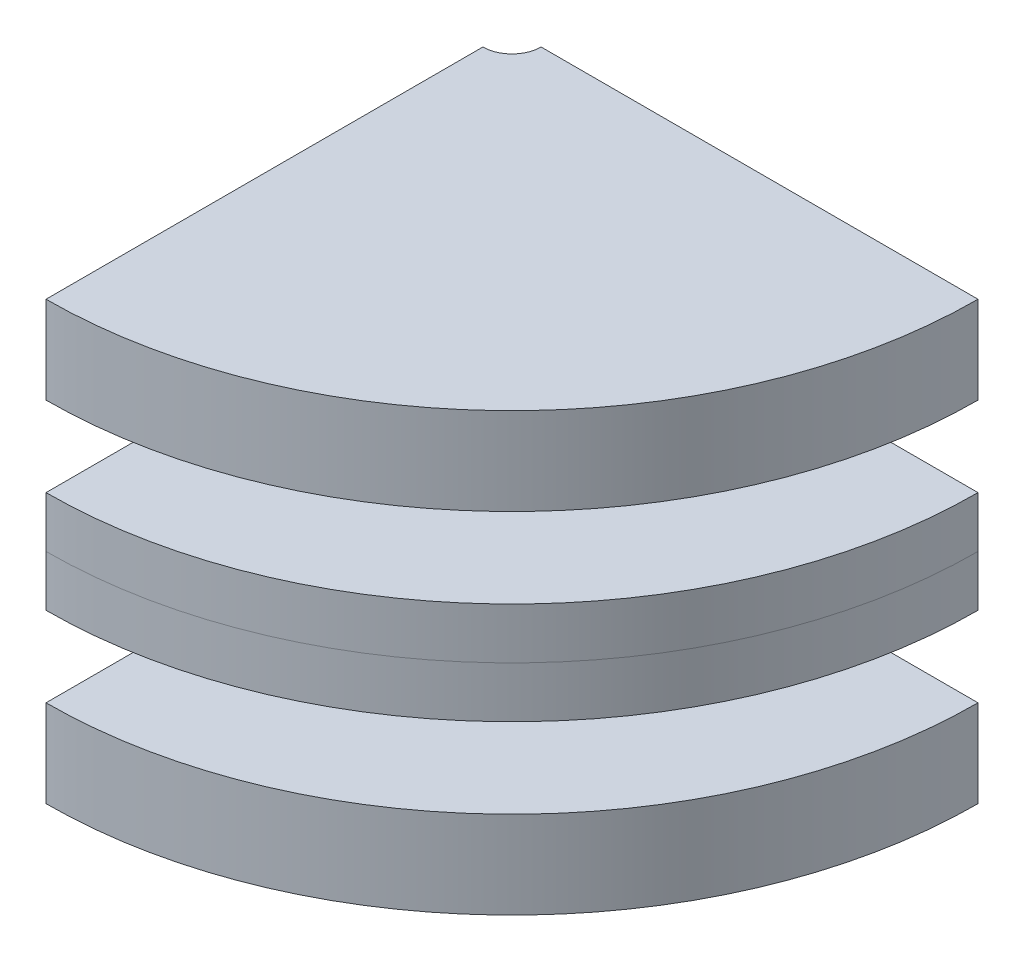
ISO-10303-21;
HEADER;
FILE_DESCRIPTION(('STEP AP214'),'2;1');
FILE_NAME('part.step','',(''),(''),'','','');
FILE_SCHEMA(('AUTOMOTIVE_DESIGN { 1 0 10303 214 1 1 1 1 }'));
ENDSEC;
DATA;
#1=APPLICATION_CONTEXT('core data for automotive mechanical design processes');
#2=APPLICATION_PROTOCOL_DEFINITION('international standard','automotive_design',2000,#1);
#3=PRODUCT_CONTEXT('',#1,'mechanical');
#4=PRODUCT('Part','Part','',(#3));
#5=PRODUCT_RELATED_PRODUCT_CATEGORY('part','',(#4));
#6=PRODUCT_DEFINITION_FORMATION('','',#4);
#7=PRODUCT_DEFINITION_CONTEXT('part definition',#1,'design');
#8=PRODUCT_DEFINITION('design','',#6,#7);
#9=PRODUCT_DEFINITION_SHAPE('','',#8);
#10=(LENGTH_UNIT() NAMED_UNIT(*) SI_UNIT(.MILLI.,.METRE.));
#11=(NAMED_UNIT(*) PLANE_ANGLE_UNIT() SI_UNIT($,.RADIAN.));
#12=(NAMED_UNIT(*) SI_UNIT($,.STERADIAN.) SOLID_ANGLE_UNIT());
#13=UNCERTAINTY_MEASURE_WITH_UNIT(LENGTH_MEASURE(1.E-05),#10,'distance_accuracy_value','');
#14=(GEOMETRIC_REPRESENTATION_CONTEXT(3) GLOBAL_UNCERTAINTY_ASSIGNED_CONTEXT((#13)) GLOBAL_UNIT_ASSIGNED_CONTEXT((#10,
#11,#12)) REPRESENTATION_CONTEXT('',''));
#15=CARTESIAN_POINT('',(0.,0.,0.));
#16=DIRECTION('',(0.,0.,1.));
#17=DIRECTION('',(1.,0.,0.));
#18=AXIS2_PLACEMENT_3D('',#15,#16,#17);
#19=CARTESIAN_POINT('',(0.,7.5,-16.));
#20=DIRECTION('',(0.,1.,0.));
#21=DIRECTION('',(0.,0.,-1.));
#22=AXIS2_PLACEMENT_3D('',#19,#20,#21);
#23=CYLINDRICAL_SURFACE('',#22,16.);
#24=CARTESIAN_POINT('',(0.,9.25,-16.));
#25=DIRECTION('',(0.,1.,0.));
#26=DIRECTION('',(0.,0.,1.));
#27=AXIS2_PLACEMENT_3D('',#24,#25,#26);
#28=CIRCLE('',#27,16.);
#29=CARTESIAN_POINT('',(0.,9.25,0.));
#30=VERTEX_POINT('',#29);
#31=CARTESIAN_POINT('',(16.,9.25,-16.));
#32=VERTEX_POINT('',#31);
#33=EDGE_CURVE('E107',#30,#32,#28,.T.);
#34=ORIENTED_EDGE('',*,*,#33,.F.);
#35=DIRECTION('',(0.,1.,0.));
#36=VECTOR('',#35,1.);
#37=CARTESIAN_POINT('',(0.,7.5,0.));
#38=LINE('',#37,#36);
#39=CARTESIAN_POINT('',(0.,7.5,0.));
#40=VERTEX_POINT('',#39);
#41=EDGE_CURVE('E106',#40,#30,#38,.T.);
#42=ORIENTED_EDGE('',*,*,#41,.F.);
#43=CARTESIAN_POINT('',(0.,7.5,-16.));
#44=DIRECTION('',(0.,1.,0.));
#45=DIRECTION('',(0.,0.,1.));
#46=AXIS2_PLACEMENT_3D('',#43,#44,#45);
#47=CIRCLE('',#46,16.);
#48=CARTESIAN_POINT('',(16.,7.5,-16.));
#49=VERTEX_POINT('',#48);
#50=EDGE_CURVE('E101',#40,#49,#47,.T.);
#51=ORIENTED_EDGE('',*,*,#50,.T.);
#52=DIRECTION('',(0.,1.,0.));
#53=VECTOR('',#52,1.);
#54=CARTESIAN_POINT('',(16.,7.5,-16.));
#55=LINE('',#54,#53);
#56=EDGE_CURVE('E12',#49,#32,#55,.T.);
#57=ORIENTED_EDGE('',*,*,#56,.T.);
#58=EDGE_LOOP('',(#34,#42,#51,#57));
#59=FACE_BOUND('',#58,.T.);
#60=ADVANCED_FACE('F44',(#59),#23,.T.);
#61=CARTESIAN_POINT('',(1.,7.5,-16.));
#62=DIRECTION('',(0.,0.,1.));
#63=DIRECTION('',(1.,0.,0.));
#64=AXIS2_PLACEMENT_3D('',#61,#62,#63);
#65=PLANE('',#64);
#66=DIRECTION('',(-1.,0.,0.));
#67=VECTOR('',#66,1.);
#68=CARTESIAN_POINT('',(1.,9.25,-16.));
#69=LINE('',#68,#67);
#70=CARTESIAN_POINT('',(1.,9.25,-16.));
#71=VERTEX_POINT('',#70);
#72=EDGE_CURVE('E109',#32,#71,#69,.T.);
#73=ORIENTED_EDGE('',*,*,#72,.F.);
#74=ORIENTED_EDGE('',*,*,#56,.F.);
#75=DIRECTION('',(-1.,0.,0.));
#76=VECTOR('',#75,1.);
#77=CARTESIAN_POINT('',(1.,7.5,-16.));
#78=LINE('',#77,#76);
#79=CARTESIAN_POINT('',(1.,7.5,-16.));
#80=VERTEX_POINT('',#79);
#81=EDGE_CURVE('E85',#49,#80,#78,.T.);
#82=ORIENTED_EDGE('',*,*,#81,.T.);
#83=DIRECTION('',(0.,1.,0.));
#84=VECTOR('',#83,1.);
#85=CARTESIAN_POINT('',(1.,7.5,-16.));
#86=LINE('',#85,#84);
#87=EDGE_CURVE('E52',#80,#71,#86,.T.);
#88=ORIENTED_EDGE('',*,*,#87,.T.);
#89=EDGE_LOOP('',(#73,#74,#82,#88));
#90=FACE_BOUND('',#89,.T.);
#91=ADVANCED_FACE('F99',(#90),#65,.F.);
#92=CARTESIAN_POINT('',(0.,7.5,-16.));
#93=DIRECTION('',(0.,1.,0.));
#94=DIRECTION('',(0.,0.,-1.));
#95=AXIS2_PLACEMENT_3D('',#92,#93,#94);
#96=CYLINDRICAL_SURFACE('',#95,1.);
#97=CARTESIAN_POINT('',(0.,9.25,-16.));
#98=DIRECTION('',(0.,-1.,0.));
#99=DIRECTION('',(0.,0.,1.));
#100=AXIS2_PLACEMENT_3D('',#97,#98,#99);
#101=CIRCLE('',#100,1.);
#102=CARTESIAN_POINT('',(0.,9.25,-15.));
#103=VERTEX_POINT('',#102);
#104=EDGE_CURVE('E95',#71,#103,#101,.T.);
#105=ORIENTED_EDGE('',*,*,#104,.F.);
#106=ORIENTED_EDGE('',*,*,#87,.F.);
#107=CARTESIAN_POINT('',(0.,7.5,-16.));
#108=DIRECTION('',(0.,-1.,0.));
#109=DIRECTION('',(0.,0.,1.));
#110=AXIS2_PLACEMENT_3D('',#107,#108,#109);
#111=CIRCLE('',#110,1.);
#112=CARTESIAN_POINT('',(0.,7.5,-15.));
#113=VERTEX_POINT('',#112);
#114=EDGE_CURVE('E88',#80,#113,#111,.T.);
#115=ORIENTED_EDGE('',*,*,#114,.T.);
#116=DIRECTION('',(0.,1.,0.));
#117=VECTOR('',#116,1.);
#118=CARTESIAN_POINT('',(0.,7.5,-15.));
#119=LINE('',#118,#117);
#120=EDGE_CURVE('E98',#113,#103,#119,.T.);
#121=ORIENTED_EDGE('',*,*,#120,.T.);
#122=EDGE_LOOP('',(#105,#106,#115,#121));
#123=FACE_BOUND('',#122,.T.);
#124=ADVANCED_FACE('F94',(#123),#96,.F.);
#125=CARTESIAN_POINT('',(0.,7.5,-15.));
#126=DIRECTION('',(1.,0.,0.));
#127=DIRECTION('',(0.,0.,-1.));
#128=AXIS2_PLACEMENT_3D('',#125,#126,#127);
#129=PLANE('',#128);
#130=DIRECTION('',(0.,0.,1.));
#131=VECTOR('',#130,1.);
#132=CARTESIAN_POINT('',(0.,9.25,-15.));
#133=LINE('',#132,#131);
#134=EDGE_CURVE('E74',#103,#30,#133,.T.);
#135=ORIENTED_EDGE('',*,*,#134,.F.);
#136=ORIENTED_EDGE('',*,*,#120,.F.);
#137=DIRECTION('',(0.,0.,1.));
#138=VECTOR('',#137,1.);
#139=CARTESIAN_POINT('',(0.,7.5,-15.));
#140=LINE('',#139,#138);
#141=EDGE_CURVE('E60',#113,#40,#140,.T.);
#142=ORIENTED_EDGE('',*,*,#141,.T.);
#143=ORIENTED_EDGE('',*,*,#41,.T.);
#144=EDGE_LOOP('',(#135,#136,#142,#143));
#145=FACE_BOUND('',#144,.T.);
#146=ADVANCED_FACE('F118',(#145),#129,.F.);
#147=CARTESIAN_POINT('',(0.,7.5,-16.));
#148=DIRECTION('',(0.,-1.,0.));
#149=DIRECTION('',(0.,0.,1.));
#150=AXIS2_PLACEMENT_3D('',#147,#148,#149);
#151=PLANE('',#150);
#152=ORIENTED_EDGE('',*,*,#50,.F.);
#153=ORIENTED_EDGE('',*,*,#141,.F.);
#154=ORIENTED_EDGE('',*,*,#114,.F.);
#155=ORIENTED_EDGE('',*,*,#81,.F.);
#156=EDGE_LOOP('',(#152,#153,#154,#155));
#157=FACE_BOUND('',#156,.T.);
#158=ADVANCED_FACE('F90',(#157),#151,.T.);
#159=CARTESIAN_POINT('',(0.,9.25,-16.));
#160=DIRECTION('',(0.,-1.,0.));
#161=DIRECTION('',(0.,0.,1.));
#162=AXIS2_PLACEMENT_3D('',#159,#160,#161);
#163=PLANE('',#162);
#164=ORIENTED_EDGE('',*,*,#33,.T.);
#165=ORIENTED_EDGE('',*,*,#72,.T.);
#166=ORIENTED_EDGE('',*,*,#104,.T.);
#167=ORIENTED_EDGE('',*,*,#134,.T.);
#168=EDGE_LOOP('',(#164,#165,#166,#167));
#169=FACE_BOUND('',#168,.T.);
#170=ADVANCED_FACE('F114',(#169),#163,.F.);
#171=CLOSED_SHELL('',(#60,#91,#124,#146,#158,#170));
#172=MANIFOLD_SOLID_BREP('B2',#171);
#173=CARTESIAN_POINT('',(0.,12.,-16.));
#174=DIRECTION('',(0.,1.,0.));
#175=DIRECTION('',(0.,0.,-1.));
#176=AXIS2_PLACEMENT_3D('',#173,#174,#175);
#177=CYLINDRICAL_SURFACE('',#176,16.);
#178=CARTESIAN_POINT('',(0.,15.,-16.));
#179=DIRECTION('',(0.,1.,0.));
#180=DIRECTION('',(0.,0.,1.));
#181=AXIS2_PLACEMENT_3D('',#178,#179,#180);
#182=CIRCLE('',#181,16.);
#183=CARTESIAN_POINT('',(0.,15.,0.));
#184=VERTEX_POINT('',#183);
#185=CARTESIAN_POINT('',(16.,15.,-16.));
#186=VERTEX_POINT('',#185);
#187=EDGE_CURVE('E241',#184,#186,#182,.T.);
#188=ORIENTED_EDGE('',*,*,#187,.F.);
#189=DIRECTION('',(0.,1.,0.));
#190=VECTOR('',#189,1.);
#191=CARTESIAN_POINT('',(0.,12.,0.));
#192=LINE('',#191,#190);
#193=CARTESIAN_POINT('',(0.,12.,0.));
#194=VERTEX_POINT('',#193);
#195=EDGE_CURVE('E240',#194,#184,#192,.T.);
#196=ORIENTED_EDGE('',*,*,#195,.F.);
#197=CARTESIAN_POINT('',(0.,12.,-16.));
#198=DIRECTION('',(0.,1.,0.));
#199=DIRECTION('',(0.,0.,1.));
#200=AXIS2_PLACEMENT_3D('',#197,#198,#199);
#201=CIRCLE('',#200,16.);
#202=CARTESIAN_POINT('',(16.,12.,-16.));
#203=VERTEX_POINT('',#202);
#204=EDGE_CURVE('E235',#194,#203,#201,.T.);
#205=ORIENTED_EDGE('',*,*,#204,.T.);
#206=DIRECTION('',(0.,1.,0.));
#207=VECTOR('',#206,1.);
#208=CARTESIAN_POINT('',(16.,12.,-16.));
#209=LINE('',#208,#207);
#210=EDGE_CURVE('E42',#203,#186,#209,.T.);
#211=ORIENTED_EDGE('',*,*,#210,.T.);
#212=EDGE_LOOP('',(#188,#196,#205,#211));
#213=FACE_BOUND('',#212,.T.);
#214=ADVANCED_FACE('F178',(#213),#177,.T.);
#215=CARTESIAN_POINT('',(1.,12.,-16.));
#216=DIRECTION('',(0.,0.,1.));
#217=DIRECTION('',(1.,0.,0.));
#218=AXIS2_PLACEMENT_3D('',#215,#216,#217);
#219=PLANE('',#218);
#220=DIRECTION('',(-1.,0.,0.));
#221=VECTOR('',#220,1.);
#222=CARTESIAN_POINT('',(1.,15.,-16.));
#223=LINE('',#222,#221);
#224=CARTESIAN_POINT('',(1.,15.,-16.));
#225=VERTEX_POINT('',#224);
#226=EDGE_CURVE('E243',#186,#225,#223,.T.);
#227=ORIENTED_EDGE('',*,*,#226,.F.);
#228=ORIENTED_EDGE('',*,*,#210,.F.);
#229=DIRECTION('',(-1.,0.,0.));
#230=VECTOR('',#229,1.);
#231=CARTESIAN_POINT('',(1.,12.,-16.));
#232=LINE('',#231,#230);
#233=CARTESIAN_POINT('',(1.,12.,-16.));
#234=VERTEX_POINT('',#233);
#235=EDGE_CURVE('E219',#203,#234,#232,.T.);
#236=ORIENTED_EDGE('',*,*,#235,.T.);
#237=DIRECTION('',(0.,1.,0.));
#238=VECTOR('',#237,1.);
#239=CARTESIAN_POINT('',(1.,12.,-16.));
#240=LINE('',#239,#238);
#241=EDGE_CURVE('E186',#234,#225,#240,.T.);
#242=ORIENTED_EDGE('',*,*,#241,.T.);
#243=EDGE_LOOP('',(#227,#228,#236,#242));
#244=FACE_BOUND('',#243,.T.);
#245=ADVANCED_FACE('F233',(#244),#219,.F.);
#246=CARTESIAN_POINT('',(0.,12.,-16.));
#247=DIRECTION('',(0.,1.,0.));
#248=DIRECTION('',(0.,0.,-1.));
#249=AXIS2_PLACEMENT_3D('',#246,#247,#248);
#250=CYLINDRICAL_SURFACE('',#249,1.);
#251=CARTESIAN_POINT('',(0.,15.,-16.));
#252=DIRECTION('',(0.,-1.,0.));
#253=DIRECTION('',(0.,0.,1.));
#254=AXIS2_PLACEMENT_3D('',#251,#252,#253);
#255=CIRCLE('',#254,1.);
#256=CARTESIAN_POINT('',(0.,15.,-15.));
#257=VERTEX_POINT('',#256);
#258=EDGE_CURVE('E229',#225,#257,#255,.T.);
#259=ORIENTED_EDGE('',*,*,#258,.F.);
#260=ORIENTED_EDGE('',*,*,#241,.F.);
#261=CARTESIAN_POINT('',(0.,12.,-16.));
#262=DIRECTION('',(0.,-1.,0.));
#263=DIRECTION('',(0.,0.,1.));
#264=AXIS2_PLACEMENT_3D('',#261,#262,#263);
#265=CIRCLE('',#264,1.);
#266=CARTESIAN_POINT('',(0.,12.,-15.));
#267=VERTEX_POINT('',#266);
#268=EDGE_CURVE('E222',#234,#267,#265,.T.);
#269=ORIENTED_EDGE('',*,*,#268,.T.);
#270=DIRECTION('',(0.,1.,0.));
#271=VECTOR('',#270,1.);
#272=CARTESIAN_POINT('',(0.,12.,-15.));
#273=LINE('',#272,#271);
#274=EDGE_CURVE('E232',#267,#257,#273,.T.);
#275=ORIENTED_EDGE('',*,*,#274,.T.);
#276=EDGE_LOOP('',(#259,#260,#269,#275));
#277=FACE_BOUND('',#276,.T.);
#278=ADVANCED_FACE('F228',(#277),#250,.F.);
#279=CARTESIAN_POINT('',(0.,12.,0.));
#280=DIRECTION('',(1.,0.,0.));
#281=DIRECTION('',(0.,0.,-1.));
#282=AXIS2_PLACEMENT_3D('',#279,#280,#281);
#283=PLANE('',#282);
#284=DIRECTION('',(0.,0.,1.));
#285=VECTOR('',#284,1.);
#286=CARTESIAN_POINT('',(0.,15.,0.));
#287=LINE('',#286,#285);
#288=EDGE_CURVE('E208',#257,#184,#287,.T.);
#289=ORIENTED_EDGE('',*,*,#288,.F.);
#290=ORIENTED_EDGE('',*,*,#274,.F.);
#291=DIRECTION('',(0.,0.,1.));
#292=VECTOR('',#291,1.);
#293=CARTESIAN_POINT('',(0.,12.,0.));
#294=LINE('',#293,#292);
#295=EDGE_CURVE('E194',#267,#194,#294,.T.);
#296=ORIENTED_EDGE('',*,*,#295,.T.);
#297=ORIENTED_EDGE('',*,*,#195,.T.);
#298=EDGE_LOOP('',(#289,#290,#296,#297));
#299=FACE_BOUND('',#298,.T.);
#300=ADVANCED_FACE('F252',(#299),#283,.F.);
#301=CARTESIAN_POINT('',(0.,12.,-16.));
#302=DIRECTION('',(0.,-1.,0.));
#303=DIRECTION('',(0.,0.,1.));
#304=AXIS2_PLACEMENT_3D('',#301,#302,#303);
#305=PLANE('',#304);
#306=ORIENTED_EDGE('',*,*,#204,.F.);
#307=ORIENTED_EDGE('',*,*,#295,.F.);
#308=ORIENTED_EDGE('',*,*,#268,.F.);
#309=ORIENTED_EDGE('',*,*,#235,.F.);
#310=EDGE_LOOP('',(#306,#307,#308,#309));
#311=FACE_BOUND('',#310,.T.);
#312=ADVANCED_FACE('F224',(#311),#305,.T.);
#313=CARTESIAN_POINT('',(0.,15.,-16.));
#314=DIRECTION('',(0.,-1.,0.));
#315=DIRECTION('',(0.,0.,1.));
#316=AXIS2_PLACEMENT_3D('',#313,#314,#315);
#317=PLANE('',#316);
#318=ORIENTED_EDGE('',*,*,#187,.T.);
#319=ORIENTED_EDGE('',*,*,#226,.T.);
#320=ORIENTED_EDGE('',*,*,#258,.T.);
#321=ORIENTED_EDGE('',*,*,#288,.T.);
#322=EDGE_LOOP('',(#318,#319,#320,#321));
#323=FACE_BOUND('',#322,.T.);
#324=ADVANCED_FACE('F248',(#323),#317,.F.);
#325=CLOSED_SHELL('',(#214,#245,#278,#300,#312,#324));
#326=MANIFOLD_SOLID_BREP('B6',#325);
#327=CARTESIAN_POINT('',(0.,7.5,-16.));
#328=DIRECTION('',(0.,-1.,0.));
#329=DIRECTION('',(0.,0.,-1.));
#330=AXIS2_PLACEMENT_3D('',#327,#328,#329);
#331=CYLINDRICAL_SURFACE('',#330,16.);
#332=CARTESIAN_POINT('',(0.,5.75,-16.));
#333=DIRECTION('',(0.,1.,0.));
#334=DIRECTION('',(0.,0.,1.));
#335=AXIS2_PLACEMENT_3D('',#332,#333,#334);
#336=CIRCLE('',#335,16.);
#337=CARTESIAN_POINT('',(0.,5.75,0.));
#338=VERTEX_POINT('',#337);
#339=CARTESIAN_POINT('',(16.,5.75,-16.));
#340=VERTEX_POINT('',#339);
#341=EDGE_CURVE('E374',#338,#340,#336,.T.);
#342=ORIENTED_EDGE('',*,*,#341,.T.);
#343=DIRECTION('',(0.,-1.,0.));
#344=VECTOR('',#343,1.);
#345=CARTESIAN_POINT('',(16.,7.5,-16.));
#346=LINE('',#345,#344);
#347=CARTESIAN_POINT('',(16.,7.5,-16.));
#348=VERTEX_POINT('',#347);
#349=EDGE_CURVE('E176',#348,#340,#346,.T.);
#350=ORIENTED_EDGE('',*,*,#349,.F.);
#351=CARTESIAN_POINT('',(0.,7.5,-16.));
#352=DIRECTION('',(0.,1.,0.));
#353=DIRECTION('',(0.,0.,1.));
#354=AXIS2_PLACEMENT_3D('',#351,#352,#353);
#355=CIRCLE('',#354,16.);
#356=CARTESIAN_POINT('',(0.,7.5,0.));
#357=VERTEX_POINT('',#356);
#358=EDGE_CURVE('E362',#357,#348,#355,.T.);
#359=ORIENTED_EDGE('',*,*,#358,.F.);
#360=DIRECTION('',(0.,-1.,0.));
#361=VECTOR('',#360,1.);
#362=CARTESIAN_POINT('',(0.,7.5,0.));
#363=LINE('',#362,#361);
#364=EDGE_CURVE('E370',#357,#338,#363,.T.);
#365=ORIENTED_EDGE('',*,*,#364,.T.);
#366=EDGE_LOOP('',(#342,#350,#359,#365));
#367=FACE_BOUND('',#366,.T.);
#368=ADVANCED_FACE('F311',(#367),#331,.T.);
#369=CARTESIAN_POINT('',(1.,7.5,-16.));
#370=DIRECTION('',(0.,0.,1.));
#371=DIRECTION('',(1.,0.,0.));
#372=AXIS2_PLACEMENT_3D('',#369,#370,#371);
#373=PLANE('',#372);
#374=DIRECTION('',(-1.,0.,0.));
#375=VECTOR('',#374,1.);
#376=CARTESIAN_POINT('',(1.,5.75,-16.));
#377=LINE('',#376,#375);
#378=CARTESIAN_POINT('',(1.,5.75,-16.));
#379=VERTEX_POINT('',#378);
#380=EDGE_CURVE('E366',#340,#379,#377,.T.);
#381=ORIENTED_EDGE('',*,*,#380,.T.);
#382=DIRECTION('',(0.,-1.,0.));
#383=VECTOR('',#382,1.);
#384=CARTESIAN_POINT('',(1.,7.5,-16.));
#385=LINE('',#384,#383);
#386=CARTESIAN_POINT('',(1.,7.5,-16.));
#387=VERTEX_POINT('',#386);
#388=EDGE_CURVE('E319',#387,#379,#385,.T.);
#389=ORIENTED_EDGE('',*,*,#388,.F.);
#390=DIRECTION('',(-1.,0.,0.));
#391=VECTOR('',#390,1.);
#392=CARTESIAN_POINT('',(1.,7.5,-16.));
#393=LINE('',#392,#391);
#394=EDGE_CURVE('E357',#348,#387,#393,.T.);
#395=ORIENTED_EDGE('',*,*,#394,.F.);
#396=ORIENTED_EDGE('',*,*,#349,.T.);
#397=EDGE_LOOP('',(#381,#389,#395,#396));
#398=FACE_BOUND('',#397,.T.);
#399=ADVANCED_FACE('F365',(#398),#373,.F.);
#400=CARTESIAN_POINT('',(0.,7.5,-16.));
#401=DIRECTION('',(0.,-1.,0.));
#402=DIRECTION('',(0.,0.,-1.));
#403=AXIS2_PLACEMENT_3D('',#400,#401,#402);
#404=CYLINDRICAL_SURFACE('',#403,1.);
#405=CARTESIAN_POINT('',(0.,5.75,-16.));
#406=DIRECTION('',(0.,-1.,0.));
#407=DIRECTION('',(0.,0.,1.));
#408=AXIS2_PLACEMENT_3D('',#405,#406,#407);
#409=CIRCLE('',#408,1.);
#410=CARTESIAN_POINT('',(0.,5.75,-15.));
#411=VERTEX_POINT('',#410);
#412=EDGE_CURVE('E344',#379,#411,#409,.T.);
#413=ORIENTED_EDGE('',*,*,#412,.T.);
#414=DIRECTION('',(0.,-1.,0.));
#415=VECTOR('',#414,1.);
#416=CARTESIAN_POINT('',(0.,7.5,-15.));
#417=LINE('',#416,#415);
#418=CARTESIAN_POINT('',(0.,7.5,-15.));
#419=VERTEX_POINT('',#418);
#420=EDGE_CURVE('E367',#419,#411,#417,.T.);
#421=ORIENTED_EDGE('',*,*,#420,.F.);
#422=CARTESIAN_POINT('',(0.,7.5,-16.));
#423=DIRECTION('',(0.,-1.,0.));
#424=DIRECTION('',(0.,0.,1.));
#425=AXIS2_PLACEMENT_3D('',#422,#423,#424);
#426=CIRCLE('',#425,1.);
#427=EDGE_CURVE('E360',#387,#419,#426,.T.);
#428=ORIENTED_EDGE('',*,*,#427,.F.);
#429=ORIENTED_EDGE('',*,*,#388,.T.);
#430=EDGE_LOOP('',(#413,#421,#428,#429));
#431=FACE_BOUND('',#430,.T.);
#432=ADVANCED_FACE('F368',(#431),#404,.F.);
#433=CARTESIAN_POINT('',(0.,7.5,-15.));
#434=DIRECTION('',(1.,0.,0.));
#435=DIRECTION('',(0.,0.,-1.));
#436=AXIS2_PLACEMENT_3D('',#433,#434,#435);
#437=PLANE('',#436);
#438=DIRECTION('',(0.,0.,1.));
#439=VECTOR('',#438,1.);
#440=CARTESIAN_POINT('',(0.,5.75,-15.));
#441=LINE('',#440,#439);
#442=EDGE_CURVE('E350',#411,#338,#441,.T.);
#443=ORIENTED_EDGE('',*,*,#442,.T.);
#444=ORIENTED_EDGE('',*,*,#364,.F.);
#445=DIRECTION('',(0.,0.,1.));
#446=VECTOR('',#445,1.);
#447=CARTESIAN_POINT('',(0.,7.5,-15.));
#448=LINE('',#447,#446);
#449=EDGE_CURVE('E327',#419,#357,#448,.T.);
#450=ORIENTED_EDGE('',*,*,#449,.F.);
#451=ORIENTED_EDGE('',*,*,#420,.T.);
#452=EDGE_LOOP('',(#443,#444,#450,#451));
#453=FACE_BOUND('',#452,.T.);
#454=ADVANCED_FACE('F381',(#453),#437,.F.);
#455=CARTESIAN_POINT('',(0.,7.5,-16.));
#456=DIRECTION('',(0.,1.,0.));
#457=DIRECTION('',(0.,0.,1.));
#458=AXIS2_PLACEMENT_3D('',#455,#456,#457);
#459=PLANE('',#458);
#460=ORIENTED_EDGE('',*,*,#358,.T.);
#461=ORIENTED_EDGE('',*,*,#394,.T.);
#462=ORIENTED_EDGE('',*,*,#427,.T.);
#463=ORIENTED_EDGE('',*,*,#449,.T.);
#464=EDGE_LOOP('',(#460,#461,#462,#463));
#465=FACE_BOUND('',#464,.T.);
#466=ADVANCED_FACE('F358',(#465),#459,.T.);
#467=CARTESIAN_POINT('',(0.,5.75,-16.));
#468=DIRECTION('',(0.,1.,0.));
#469=DIRECTION('',(0.,0.,1.));
#470=AXIS2_PLACEMENT_3D('',#467,#468,#469);
#471=PLANE('',#470);
#472=ORIENTED_EDGE('',*,*,#341,.F.);
#473=ORIENTED_EDGE('',*,*,#442,.F.);
#474=ORIENTED_EDGE('',*,*,#412,.F.);
#475=ORIENTED_EDGE('',*,*,#380,.F.);
#476=EDGE_LOOP('',(#472,#473,#474,#475));
#477=FACE_BOUND('',#476,.T.);
#478=ADVANCED_FACE('F384',(#477),#471,.F.);
#479=CLOSED_SHELL('',(#368,#399,#432,#454,#466,#478));
#480=MANIFOLD_SOLID_BREP('B36',#479);
#481=CARTESIAN_POINT('',(0.,3.,-16.));
#482=DIRECTION('',(0.,-1.,0.));
#483=DIRECTION('',(0.,0.,-1.));
#484=AXIS2_PLACEMENT_3D('',#481,#482,#483);
#485=CYLINDRICAL_SURFACE('',#484,16.);
#486=CARTESIAN_POINT('',(0.,0.,-16.));
#487=DIRECTION('',(0.,1.,0.));
#488=DIRECTION('',(0.,0.,1.));
#489=AXIS2_PLACEMENT_3D('',#486,#487,#488);
#490=CIRCLE('',#489,16.);
#491=CARTESIAN_POINT('',(0.,0.,0.));
#492=VERTEX_POINT('',#491);
#493=CARTESIAN_POINT('',(16.,0.,-16.));
#494=VERTEX_POINT('',#493);
#495=EDGE_CURVE('E498',#492,#494,#490,.T.);
#496=ORIENTED_EDGE('',*,*,#495,.T.);
#497=DIRECTION('',(0.,-1.,0.));
#498=VECTOR('',#497,1.);
#499=CARTESIAN_POINT('',(16.,3.,-16.));
#500=LINE('',#499,#498);
#501=CARTESIAN_POINT('',(16.,3.,-16.));
#502=VERTEX_POINT('',#501);
#503=EDGE_CURVE('E309',#502,#494,#500,.T.);
#504=ORIENTED_EDGE('',*,*,#503,.F.);
#505=CARTESIAN_POINT('',(0.,3.,-16.));
#506=DIRECTION('',(0.,1.,0.));
#507=DIRECTION('',(0.,0.,1.));
#508=AXIS2_PLACEMENT_3D('',#505,#506,#507);
#509=CIRCLE('',#508,16.);
#510=CARTESIAN_POINT('',(0.,3.,0.));
#511=VERTEX_POINT('',#510);
#512=EDGE_CURVE('E486',#511,#502,#509,.T.);
#513=ORIENTED_EDGE('',*,*,#512,.F.);
#514=DIRECTION('',(0.,-1.,0.));
#515=VECTOR('',#514,1.);
#516=CARTESIAN_POINT('',(0.,3.,0.));
#517=LINE('',#516,#515);
#518=EDGE_CURVE('E494',#511,#492,#517,.T.);
#519=ORIENTED_EDGE('',*,*,#518,.T.);
#520=EDGE_LOOP('',(#496,#504,#513,#519));
#521=FACE_BOUND('',#520,.T.);
#522=ADVANCED_FACE('F435',(#521),#485,.T.);
#523=CARTESIAN_POINT('',(1.,3.,-16.));
#524=DIRECTION('',(0.,0.,1.));
#525=DIRECTION('',(1.,0.,0.));
#526=AXIS2_PLACEMENT_3D('',#523,#524,#525);
#527=PLANE('',#526);
#528=DIRECTION('',(-1.,0.,0.));
#529=VECTOR('',#528,1.);
#530=CARTESIAN_POINT('',(1.,0.,-16.));
#531=LINE('',#530,#529);
#532=CARTESIAN_POINT('',(1.,0.,-16.));
#533=VERTEX_POINT('',#532);
#534=EDGE_CURVE('E490',#494,#533,#531,.T.);
#535=ORIENTED_EDGE('',*,*,#534,.T.);
#536=DIRECTION('',(0.,-1.,0.));
#537=VECTOR('',#536,1.);
#538=CARTESIAN_POINT('',(1.,3.,-16.));
#539=LINE('',#538,#537);
#540=CARTESIAN_POINT('',(1.,3.,-16.));
#541=VERTEX_POINT('',#540);
#542=EDGE_CURVE('E443',#541,#533,#539,.T.);
#543=ORIENTED_EDGE('',*,*,#542,.F.);
#544=DIRECTION('',(-1.,0.,0.));
#545=VECTOR('',#544,1.);
#546=CARTESIAN_POINT('',(1.,3.,-16.));
#547=LINE('',#546,#545);
#548=EDGE_CURVE('E481',#502,#541,#547,.T.);
#549=ORIENTED_EDGE('',*,*,#548,.F.);
#550=ORIENTED_EDGE('',*,*,#503,.T.);
#551=EDGE_LOOP('',(#535,#543,#549,#550));
#552=FACE_BOUND('',#551,.T.);
#553=ADVANCED_FACE('F489',(#552),#527,.F.);
#554=CARTESIAN_POINT('',(0.,3.,-16.));
#555=DIRECTION('',(0.,-1.,0.));
#556=DIRECTION('',(0.,0.,-1.));
#557=AXIS2_PLACEMENT_3D('',#554,#555,#556);
#558=CYLINDRICAL_SURFACE('',#557,1.);
#559=CARTESIAN_POINT('',(0.,0.,-16.));
#560=DIRECTION('',(0.,-1.,0.));
#561=DIRECTION('',(0.,0.,1.));
#562=AXIS2_PLACEMENT_3D('',#559,#560,#561);
#563=CIRCLE('',#562,1.);
#564=CARTESIAN_POINT('',(0.,0.,-15.));
#565=VERTEX_POINT('',#564);
#566=EDGE_CURVE('E468',#533,#565,#563,.T.);
#567=ORIENTED_EDGE('',*,*,#566,.T.);
#568=DIRECTION('',(0.,-1.,0.));
#569=VECTOR('',#568,1.);
#570=CARTESIAN_POINT('',(0.,3.,-15.));
#571=LINE('',#570,#569);
#572=CARTESIAN_POINT('',(0.,3.,-15.));
#573=VERTEX_POINT('',#572);
#574=EDGE_CURVE('E491',#573,#565,#571,.T.);
#575=ORIENTED_EDGE('',*,*,#574,.F.);
#576=CARTESIAN_POINT('',(0.,3.,-16.));
#577=DIRECTION('',(0.,-1.,0.));
#578=DIRECTION('',(0.,0.,1.));
#579=AXIS2_PLACEMENT_3D('',#576,#577,#578);
#580=CIRCLE('',#579,1.);
#581=EDGE_CURVE('E484',#541,#573,#580,.T.);
#582=ORIENTED_EDGE('',*,*,#581,.F.);
#583=ORIENTED_EDGE('',*,*,#542,.T.);
#584=EDGE_LOOP('',(#567,#575,#582,#583));
#585=FACE_BOUND('',#584,.T.);
#586=ADVANCED_FACE('F492',(#585),#558,.F.);
#587=CARTESIAN_POINT('',(0.,3.,0.));
#588=DIRECTION('',(1.,0.,0.));
#589=DIRECTION('',(0.,0.,-1.));
#590=AXIS2_PLACEMENT_3D('',#587,#588,#589);
#591=PLANE('',#590);
#592=DIRECTION('',(0.,0.,1.));
#593=VECTOR('',#592,1.);
#594=CARTESIAN_POINT('',(0.,0.,0.));
#595=LINE('',#594,#593);
#596=EDGE_CURVE('E474',#565,#492,#595,.T.);
#597=ORIENTED_EDGE('',*,*,#596,.T.);
#598=ORIENTED_EDGE('',*,*,#518,.F.);
#599=DIRECTION('',(0.,0.,1.));
#600=VECTOR('',#599,1.);
#601=CARTESIAN_POINT('',(0.,3.,0.));
#602=LINE('',#601,#600);
#603=EDGE_CURVE('E451',#573,#511,#602,.T.);
#604=ORIENTED_EDGE('',*,*,#603,.F.);
#605=ORIENTED_EDGE('',*,*,#574,.T.);
#606=EDGE_LOOP('',(#597,#598,#604,#605));
#607=FACE_BOUND('',#606,.T.);
#608=ADVANCED_FACE('F505',(#607),#591,.F.);
#609=CARTESIAN_POINT('',(0.,3.,-16.));
#610=DIRECTION('',(0.,1.,0.));
#611=DIRECTION('',(0.,0.,1.));
#612=AXIS2_PLACEMENT_3D('',#609,#610,#611);
#613=PLANE('',#612);
#614=ORIENTED_EDGE('',*,*,#512,.T.);
#615=ORIENTED_EDGE('',*,*,#548,.T.);
#616=ORIENTED_EDGE('',*,*,#581,.T.);
#617=ORIENTED_EDGE('',*,*,#603,.T.);
#618=EDGE_LOOP('',(#614,#615,#616,#617));
#619=FACE_BOUND('',#618,.T.);
#620=ADVANCED_FACE('F482',(#619),#613,.T.);
#621=CARTESIAN_POINT('',(0.,0.,-16.));
#622=DIRECTION('',(0.,1.,0.));
#623=DIRECTION('',(0.,0.,1.));
#624=AXIS2_PLACEMENT_3D('',#621,#622,#623);
#625=PLANE('',#624);
#626=ORIENTED_EDGE('',*,*,#495,.F.);
#627=ORIENTED_EDGE('',*,*,#596,.F.);
#628=ORIENTED_EDGE('',*,*,#566,.F.);
#629=ORIENTED_EDGE('',*,*,#534,.F.);
#630=EDGE_LOOP('',(#626,#627,#628,#629));
#631=FACE_BOUND('',#630,.T.);
#632=ADVANCED_FACE('F508',(#631),#625,.F.);
#633=CLOSED_SHELL('',(#522,#553,#586,#608,#620,#632));
#634=MANIFOLD_SOLID_BREP('B170',#633);
#635=ADVANCED_BREP_SHAPE_REPRESENTATION('',(#18,#172,#326,#480,#634),#14);
#636=SHAPE_DEFINITION_REPRESENTATION(#9,#635);
ENDSEC;
END-ISO-10303-21;
